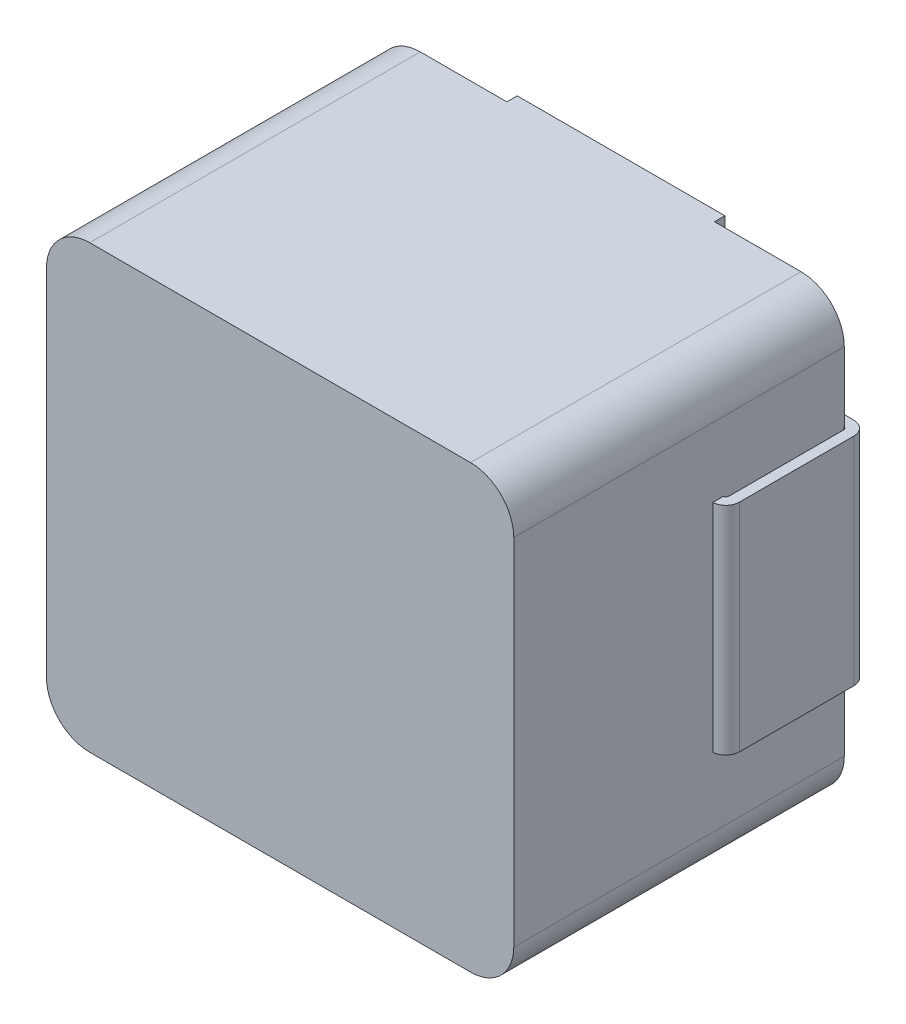
ISO-10303-21;
HEADER;
FILE_DESCRIPTION(('STEP AP214'),'2;1');
FILE_NAME('part.step','',(''),(''),'','','');
FILE_SCHEMA(('AUTOMOTIVE_DESIGN { 1 0 10303 214 1 1 1 1 }'));
ENDSEC;
DATA;
#1=APPLICATION_CONTEXT('core data for automotive mechanical design processes');
#2=APPLICATION_PROTOCOL_DEFINITION('international standard','automotive_design',2000,#1);
#3=PRODUCT_CONTEXT('',#1,'mechanical');
#4=PRODUCT('Part','Part','',(#3));
#5=PRODUCT_RELATED_PRODUCT_CATEGORY('part','',(#4));
#6=PRODUCT_DEFINITION_FORMATION('','',#4);
#7=PRODUCT_DEFINITION_CONTEXT('part definition',#1,'design');
#8=PRODUCT_DEFINITION('design','',#6,#7);
#9=PRODUCT_DEFINITION_SHAPE('','',#8);
#10=(LENGTH_UNIT() NAMED_UNIT(*) SI_UNIT(.MILLI.,.METRE.));
#11=(NAMED_UNIT(*) PLANE_ANGLE_UNIT() SI_UNIT($,.RADIAN.));
#12=(NAMED_UNIT(*) SI_UNIT($,.STERADIAN.) SOLID_ANGLE_UNIT());
#13=UNCERTAINTY_MEASURE_WITH_UNIT(LENGTH_MEASURE(1.E-05),#10,'distance_accuracy_value','');
#14=(GEOMETRIC_REPRESENTATION_CONTEXT(3) GLOBAL_UNCERTAINTY_ASSIGNED_CONTEXT((#13)) GLOBAL_UNIT_ASSIGNED_CONTEXT((#10,
#11,#12)) REPRESENTATION_CONTEXT('',''));
#15=CARTESIAN_POINT('',(0.,0.,0.));
#16=DIRECTION('',(0.,0.,1.));
#17=DIRECTION('',(1.,0.,0.));
#18=AXIS2_PLACEMENT_3D('',#15,#16,#17);
#19=CARTESIAN_POINT('',(3.4671,-1.5875,0.2794));
#20=DIRECTION('',(-1.,0.,0.));
#21=DIRECTION('',(0.,0.,1.));
#22=AXIS2_PLACEMENT_3D('',#19,#20,#21);
#23=PLANE('',#22);
#24=DIRECTION('',(0.,1.,0.));
#25=VECTOR('',#24,1.);
#26=CARTESIAN_POINT('',(3.4671,-1.5875,0.2794));
#27=LINE('',#26,#25);
#28=CARTESIAN_POINT('',(3.4671,1.5875,0.2794));
#29=VERTEX_POINT('',#28);
#30=CARTESIAN_POINT('',(3.4671,-1.5875,0.2794));
#31=VERTEX_POINT('',#30);
#32=EDGE_CURVE('E205',#29,#31,#27,.F.);
#33=ORIENTED_EDGE('',*,*,#32,.T.);
#34=DIRECTION('',(0.,0.,1.));
#35=VECTOR('',#34,1.);
#36=CARTESIAN_POINT('',(3.4671,-1.5875,0.0762));
#37=LINE('',#36,#35);
#38=CARTESIAN_POINT('',(3.4671,-1.5875,1.9558));
#39=VERTEX_POINT('',#38);
#40=EDGE_CURVE('E364',#31,#39,#37,.T.);
#41=ORIENTED_EDGE('',*,*,#40,.T.);
#42=DIRECTION('',(0.,1.,0.));
#43=VECTOR('',#42,1.);
#44=CARTESIAN_POINT('',(3.4671,-1.5875,1.9558));
#45=LINE('',#44,#43);
#46=CARTESIAN_POINT('',(3.4671,1.5875,1.9558));
#47=VERTEX_POINT('',#46);
#48=EDGE_CURVE('E400',#39,#47,#45,.T.);
#49=ORIENTED_EDGE('',*,*,#48,.T.);
#50=DIRECTION('',(0.,0.,1.));
#51=VECTOR('',#50,1.);
#52=CARTESIAN_POINT('',(3.4671,1.5875,0.0762));
#53=LINE('',#52,#51);
#54=EDGE_CURVE('E209',#29,#47,#53,.T.);
#55=ORIENTED_EDGE('',*,*,#54,.F.);
#56=EDGE_LOOP('',(#33,#41,#49,#55));
#57=FACE_BOUND('',#56,.T.);
#58=ADVANCED_FACE('F17',(#57),#23,.T.);
#59=CARTESIAN_POINT('',(3.4163,-1.5875,0.2794));
#60=DIRECTION('',(0.,1.,0.));
#61=DIRECTION('',(0.,0.,1.));
#62=AXIS2_PLACEMENT_3D('',#59,#60,#61);
#63=CYLINDRICAL_SURFACE('',#62,0.2032);
#64=DIRECTION('',(0.,1.,0.));
#65=VECTOR('',#64,1.);
#66=CARTESIAN_POINT('',(3.6195,-1.5875,0.2794));
#67=LINE('',#66,#65);
#68=CARTESIAN_POINT('',(3.6195,-1.5875,0.2794));
#69=VERTEX_POINT('',#68);
#70=CARTESIAN_POINT('',(3.6195,1.5875,0.2794));
#71=VERTEX_POINT('',#70);
#72=EDGE_CURVE('E446',#69,#71,#67,.T.);
#73=ORIENTED_EDGE('',*,*,#72,.F.);
#74=CARTESIAN_POINT('',(3.4163,-1.5875,0.2794));
#75=DIRECTION('',(0.,1.,0.));
#76=DIRECTION('',(0.,0.,1.));
#77=AXIS2_PLACEMENT_3D('',#74,#75,#76);
#78=CIRCLE('',#77,0.2032);
#79=CARTESIAN_POINT('',(3.4163,-1.5875,0.0762));
#80=VERTEX_POINT('',#79);
#81=EDGE_CURVE('E357',#69,#80,#78,.T.);
#82=ORIENTED_EDGE('',*,*,#81,.T.);
#83=DIRECTION('',(0.,1.,0.));
#84=VECTOR('',#83,1.);
#85=CARTESIAN_POINT('',(3.4163,-1.5875,0.0762));
#86=LINE('',#85,#84);
#87=CARTESIAN_POINT('',(3.4163,1.5875,0.0762));
#88=VERTEX_POINT('',#87);
#89=EDGE_CURVE('E454',#88,#80,#86,.F.);
#90=ORIENTED_EDGE('',*,*,#89,.F.);
#91=CARTESIAN_POINT('',(3.4163,1.5875,0.2794));
#92=DIRECTION('',(0.,1.,0.));
#93=DIRECTION('',(0.,0.,1.));
#94=AXIS2_PLACEMENT_3D('',#91,#92,#93);
#95=CIRCLE('',#94,0.2032);
#96=EDGE_CURVE('E384',#71,#88,#95,.T.);
#97=ORIENTED_EDGE('',*,*,#96,.F.);
#98=EDGE_LOOP('',(#73,#82,#90,#97));
#99=FACE_BOUND('',#98,.T.);
#100=ADVANCED_FACE('F515',(#99),#63,.T.);
#101=CARTESIAN_POINT('',(3.4163,-1.5875,0.0762));
#102=DIRECTION('',(0.,0.,-1.));
#103=DIRECTION('',(-1.,0.,0.));
#104=AXIS2_PLACEMENT_3D('',#101,#102,#103);
#105=PLANE('',#104);
#106=ORIENTED_EDGE('',*,*,#89,.T.);
#107=DIRECTION('',(1.,0.,0.));
#108=VECTOR('',#107,1.);
#109=CARTESIAN_POINT('',(0.,-1.5875,0.0762));
#110=LINE('',#109,#108);
#111=CARTESIAN_POINT('',(2.0447,-1.5875,0.0762));
#112=VERTEX_POINT('',#111);
#113=EDGE_CURVE('E353',#80,#112,#110,.F.);
#114=ORIENTED_EDGE('',*,*,#113,.T.);
#115=DIRECTION('',(0.,1.,0.));
#116=VECTOR('',#115,1.);
#117=CARTESIAN_POINT('',(2.0447,-1.5875,0.0762));
#118=LINE('',#117,#116);
#119=CARTESIAN_POINT('',(2.0447,1.5875,0.0762));
#120=VERTEX_POINT('',#119);
#121=EDGE_CURVE('E433',#120,#112,#118,.F.);
#122=ORIENTED_EDGE('',*,*,#121,.F.);
#123=DIRECTION('',(1.,0.,0.));
#124=VECTOR('',#123,1.);
#125=CARTESIAN_POINT('',(0.,1.5875,0.0762));
#126=LINE('',#125,#124);
#127=EDGE_CURVE('E380',#88,#120,#126,.F.);
#128=ORIENTED_EDGE('',*,*,#127,.F.);
#129=EDGE_LOOP('',(#106,#114,#122,#128));
#130=FACE_BOUND('',#129,.T.);
#131=ADVANCED_FACE('F520',(#130),#105,.T.);
#132=CARTESIAN_POINT('',(3.6195,-1.5875,1.9558));
#133=DIRECTION('',(1.,0.,0.));
#134=DIRECTION('',(0.,0.,-1.));
#135=AXIS2_PLACEMENT_3D('',#132,#133,#134);
#136=PLANE('',#135);
#137=DIRECTION('',(0.,1.,0.));
#138=VECTOR('',#137,1.);
#139=CARTESIAN_POINT('',(3.6195,-1.5875,1.9558));
#140=LINE('',#139,#138);
#141=CARTESIAN_POINT('',(3.6195,-1.5875,1.9558));
#142=VERTEX_POINT('',#141);
#143=CARTESIAN_POINT('',(3.6195,1.5875,1.9558));
#144=VERTEX_POINT('',#143);
#145=EDGE_CURVE('E447',#142,#144,#140,.T.);
#146=ORIENTED_EDGE('',*,*,#145,.F.);
#147=DIRECTION('',(0.,0.,1.));
#148=VECTOR('',#147,1.);
#149=CARTESIAN_POINT('',(3.6195,-1.5875,0.0762));
#150=LINE('',#149,#148);
#151=EDGE_CURVE('E360',#142,#69,#150,.F.);
#152=ORIENTED_EDGE('',*,*,#151,.T.);
#153=ORIENTED_EDGE('',*,*,#72,.T.);
#154=DIRECTION('',(0.,0.,1.));
#155=VECTOR('',#154,1.);
#156=CARTESIAN_POINT('',(3.6195,1.5875,0.0762));
#157=LINE('',#156,#155);
#158=EDGE_CURVE('E387',#144,#71,#157,.F.);
#159=ORIENTED_EDGE('',*,*,#158,.F.);
#160=EDGE_LOOP('',(#146,#152,#153,#159));
#161=FACE_BOUND('',#160,.T.);
#162=ADVANCED_FACE('F926',(#161),#136,.T.);
#163=CARTESIAN_POINT('',(-2.0447,-1.5875,0.0762));
#164=DIRECTION('',(0.,0.,-1.));
#165=DIRECTION('',(-1.,0.,0.));
#166=AXIS2_PLACEMENT_3D('',#163,#164,#165);
#167=PLANE('',#166);
#168=DIRECTION('',(0.,1.,0.));
#169=VECTOR('',#168,1.);
#170=CARTESIAN_POINT('',(-2.0447,-1.5875,0.0762));
#171=LINE('',#170,#169);
#172=CARTESIAN_POINT('',(-2.0447,-1.5875,0.0762));
#173=VERTEX_POINT('',#172);
#174=CARTESIAN_POINT('',(-2.0447,1.5875,0.0762));
#175=VERTEX_POINT('',#174);
#176=EDGE_CURVE('E430',#173,#175,#171,.T.);
#177=ORIENTED_EDGE('',*,*,#176,.F.);
#178=DIRECTION('',(1.,0.,0.));
#179=VECTOR('',#178,1.);
#180=CARTESIAN_POINT('',(0.,-1.5875,0.0762));
#181=LINE('',#180,#179);
#182=CARTESIAN_POINT('',(-3.4163,-1.5875,0.0762));
#183=VERTEX_POINT('',#182);
#184=EDGE_CURVE('E311',#173,#183,#181,.F.);
#185=ORIENTED_EDGE('',*,*,#184,.T.);
#186=DIRECTION('',(0.,1.,0.));
#187=VECTOR('',#186,1.);
#188=CARTESIAN_POINT('',(-3.4163,-1.5875,0.0761999999999999));
#189=LINE('',#188,#187);
#190=CARTESIAN_POINT('',(-3.4163,1.5875,0.0762));
#191=VERTEX_POINT('',#190);
#192=EDGE_CURVE('E443',#191,#183,#189,.F.);
#193=ORIENTED_EDGE('',*,*,#192,.F.);
#194=DIRECTION('',(1.,0.,0.));
#195=VECTOR('',#194,1.);
#196=CARTESIAN_POINT('',(0.,1.5875,0.0762));
#197=LINE('',#196,#195);
#198=EDGE_CURVE('E285',#175,#191,#197,.F.);
#199=ORIENTED_EDGE('',*,*,#198,.F.);
#200=EDGE_LOOP('',(#177,#185,#193,#199));
#201=FACE_BOUND('',#200,.T.);
#202=ADVANCED_FACE('F603',(#201),#167,.T.);
#203=CARTESIAN_POINT('',(-3.4163,-1.5875,0.2794));
#204=DIRECTION('',(0.,1.,0.));
#205=DIRECTION('',(0.,0.,1.));
#206=AXIS2_PLACEMENT_3D('',#203,#204,#205);
#207=CYLINDRICAL_SURFACE('',#206,0.2032);
#208=ORIENTED_EDGE('',*,*,#192,.T.);
#209=CARTESIAN_POINT('',(-3.4163,-1.5875,0.2794));
#210=DIRECTION('',(0.,1.,0.));
#211=DIRECTION('',(0.,0.,1.));
#212=AXIS2_PLACEMENT_3D('',#209,#210,#211);
#213=CIRCLE('',#212,0.2032);
#214=CARTESIAN_POINT('',(-3.6195,-1.5875,0.2794));
#215=VERTEX_POINT('',#214);
#216=EDGE_CURVE('E310',#183,#215,#213,.T.);
#217=ORIENTED_EDGE('',*,*,#216,.T.);
#218=DIRECTION('',(0.,1.,0.));
#219=VECTOR('',#218,1.);
#220=CARTESIAN_POINT('',(-3.6195,-1.5875,0.2794));
#221=LINE('',#220,#219);
#222=CARTESIAN_POINT('',(-3.6195,1.5875,0.2794));
#223=VERTEX_POINT('',#222);
#224=EDGE_CURVE('E434',#223,#215,#221,.F.);
#225=ORIENTED_EDGE('',*,*,#224,.F.);
#226=CARTESIAN_POINT('',(-3.4163,1.5875,0.2794));
#227=DIRECTION('',(0.,1.,0.));
#228=DIRECTION('',(0.,0.,1.));
#229=AXIS2_PLACEMENT_3D('',#226,#227,#228);
#230=CIRCLE('',#229,0.2032);
#231=EDGE_CURVE('E284',#191,#223,#230,.T.);
#232=ORIENTED_EDGE('',*,*,#231,.F.);
#233=EDGE_LOOP('',(#208,#217,#225,#232));
#234=FACE_BOUND('',#233,.T.);
#235=ADVANCED_FACE('F622',(#234),#207,.T.);
#236=CARTESIAN_POINT('',(-3.4671,-1.5875,1.9558));
#237=DIRECTION('',(1.,0.,0.));
#238=DIRECTION('',(0.,0.,-1.));
#239=AXIS2_PLACEMENT_3D('',#236,#237,#238);
#240=PLANE('',#239);
#241=DIRECTION('',(0.,1.,0.));
#242=VECTOR('',#241,1.);
#243=CARTESIAN_POINT('',(-3.4671,-1.5875,1.9558));
#244=LINE('',#243,#242);
#245=CARTESIAN_POINT('',(-3.4671,1.5875,1.9558));
#246=VERTEX_POINT('',#245);
#247=CARTESIAN_POINT('',(-3.4671,-1.5875,1.9558));
#248=VERTEX_POINT('',#247);
#249=EDGE_CURVE('E439',#246,#248,#244,.F.);
#250=ORIENTED_EDGE('',*,*,#249,.T.);
#251=DIRECTION('',(0.,0.,1.));
#252=VECTOR('',#251,1.);
#253=CARTESIAN_POINT('',(-3.4671,-1.5875,0.0762));
#254=LINE('',#253,#252);
#255=CARTESIAN_POINT('',(-3.4671,-1.5875,0.2794));
#256=VERTEX_POINT('',#255);
#257=EDGE_CURVE('E305',#248,#256,#254,.F.);
#258=ORIENTED_EDGE('',*,*,#257,.T.);
#259=DIRECTION('',(0.,1.,0.));
#260=VECTOR('',#259,1.);
#261=CARTESIAN_POINT('',(-3.4671,-1.5875,0.2794));
#262=LINE('',#261,#260);
#263=CARTESIAN_POINT('',(-3.4671,1.5875,0.2794));
#264=VERTEX_POINT('',#263);
#265=EDGE_CURVE('E414',#256,#264,#262,.T.);
#266=ORIENTED_EDGE('',*,*,#265,.T.);
#267=DIRECTION('',(0.,0.,1.));
#268=VECTOR('',#267,1.);
#269=CARTESIAN_POINT('',(-3.4671,1.5875,0.0762));
#270=LINE('',#269,#268);
#271=EDGE_CURVE('E277',#246,#264,#270,.F.);
#272=ORIENTED_EDGE('',*,*,#271,.F.);
#273=EDGE_LOOP('',(#250,#258,#266,#272));
#274=FACE_BOUND('',#273,.T.);
#275=ADVANCED_FACE('F641',(#274),#240,.T.);
#276=CARTESIAN_POINT('',(-3.6195,-1.5875,0.2794));
#277=DIRECTION('',(-1.,0.,0.));
#278=DIRECTION('',(0.,0.,1.));
#279=AXIS2_PLACEMENT_3D('',#276,#277,#278);
#280=PLANE('',#279);
#281=ORIENTED_EDGE('',*,*,#224,.T.);
#282=DIRECTION('',(0.,0.,1.));
#283=VECTOR('',#282,1.);
#284=CARTESIAN_POINT('',(-3.6195,-1.5875,0.0762));
#285=LINE('',#284,#283);
#286=CARTESIAN_POINT('',(-3.6195,-1.5875,1.9558));
#287=VERTEX_POINT('',#286);
#288=EDGE_CURVE('E308',#215,#287,#285,.T.);
#289=ORIENTED_EDGE('',*,*,#288,.T.);
#290=DIRECTION('',(0.,1.,0.));
#291=VECTOR('',#290,1.);
#292=CARTESIAN_POINT('',(-3.6195,-1.5875,1.9558));
#293=LINE('',#292,#291);
#294=CARTESIAN_POINT('',(-3.6195,1.5875,1.9558));
#295=VERTEX_POINT('',#294);
#296=EDGE_CURVE('E427',#295,#287,#293,.F.);
#297=ORIENTED_EDGE('',*,*,#296,.F.);
#298=DIRECTION('',(0.,0.,1.));
#299=VECTOR('',#298,1.);
#300=CARTESIAN_POINT('',(-3.6195,1.5875,0.0762));
#301=LINE('',#300,#299);
#302=EDGE_CURVE('E282',#223,#295,#301,.T.);
#303=ORIENTED_EDGE('',*,*,#302,.F.);
#304=EDGE_LOOP('',(#281,#289,#297,#303));
#305=FACE_BOUND('',#304,.T.);
#306=ADVANCED_FACE('F628',(#305),#280,.T.);
#307=CARTESIAN_POINT('',(-2.0447,-1.5875,0.2286));
#308=DIRECTION('',(1.,0.,0.));
#309=DIRECTION('',(0.,0.,-1.));
#310=AXIS2_PLACEMENT_3D('',#307,#308,#309);
#311=PLANE('',#310);
#312=DIRECTION('',(0.,1.,0.));
#313=VECTOR('',#312,1.);
#314=CARTESIAN_POINT('',(-2.0447,-3.2385,0.2286));
#315=LINE('',#314,#313);
#316=CARTESIAN_POINT('',(-2.0447,1.5875,0.2286));
#317=VERTEX_POINT('',#316);
#318=CARTESIAN_POINT('',(-2.0447,-1.5875,0.2286));
#319=VERTEX_POINT('',#318);
#320=EDGE_CURVE('E319',#317,#319,#315,.F.);
#321=ORIENTED_EDGE('',*,*,#320,.T.);
#322=DIRECTION('',(0.,0.,1.));
#323=VECTOR('',#322,1.);
#324=CARTESIAN_POINT('',(-2.0447,-1.5875,0.0762));
#325=LINE('',#324,#323);
#326=EDGE_CURVE('E313',#319,#173,#325,.F.);
#327=ORIENTED_EDGE('',*,*,#326,.T.);
#328=ORIENTED_EDGE('',*,*,#176,.T.);
#329=DIRECTION('',(0.,0.,1.));
#330=VECTOR('',#329,1.);
#331=CARTESIAN_POINT('',(-2.0447,1.5875,0.0762));
#332=LINE('',#331,#330);
#333=EDGE_CURVE('E421',#317,#175,#332,.F.);
#334=ORIENTED_EDGE('',*,*,#333,.F.);
#335=EDGE_LOOP('',(#321,#327,#328,#334));
#336=FACE_BOUND('',#335,.T.);
#337=ADVANCED_FACE('F607',(#336),#311,.T.);
#338=CARTESIAN_POINT('',(2.0447,-1.5875,0.0762));
#339=DIRECTION('',(-1.,0.,0.));
#340=DIRECTION('',(0.,0.,1.));
#341=AXIS2_PLACEMENT_3D('',#338,#339,#340);
#342=PLANE('',#341);
#343=DIRECTION('',(0.,0.,1.));
#344=VECTOR('',#343,1.);
#345=CARTESIAN_POINT('',(2.0447,-1.5875,0.0762));
#346=LINE('',#345,#344);
#347=CARTESIAN_POINT('',(2.0447,-1.5875,0.2286));
#348=VERTEX_POINT('',#347);
#349=EDGE_CURVE('E356',#112,#348,#346,.T.);
#350=ORIENTED_EDGE('',*,*,#349,.T.);
#351=DIRECTION('',(0.,1.,0.));
#352=VECTOR('',#351,1.);
#353=CARTESIAN_POINT('',(2.0447,-3.2385,0.2286));
#354=LINE('',#353,#352);
#355=CARTESIAN_POINT('',(2.0447,1.5875,0.2286));
#356=VERTEX_POINT('',#355);
#357=EDGE_CURVE('E393',#348,#356,#354,.T.);
#358=ORIENTED_EDGE('',*,*,#357,.T.);
#359=DIRECTION('',(0.,0.,1.));
#360=VECTOR('',#359,1.);
#361=CARTESIAN_POINT('',(2.0447,1.5875,0.0762));
#362=LINE('',#361,#360);
#363=EDGE_CURVE('E383',#120,#356,#362,.T.);
#364=ORIENTED_EDGE('',*,*,#363,.F.);
#365=ORIENTED_EDGE('',*,*,#121,.T.);
#366=EDGE_LOOP('',(#350,#358,#364,#365));
#367=FACE_BOUND('',#366,.T.);
#368=ADVANCED_FACE('F525',(#367),#342,.T.);
#369=CARTESIAN_POINT('',(3.4163,-1.5875,0.2794));
#370=DIRECTION('',(0.,1.,0.));
#371=DIRECTION('',(0.,0.,1.));
#372=AXIS2_PLACEMENT_3D('',#369,#370,#371);
#373=CYLINDRICAL_SURFACE('',#372,0.0508);
#374=ORIENTED_EDGE('',*,*,#32,.F.);
#375=CARTESIAN_POINT('',(3.4163,1.5875,0.2794));
#376=DIRECTION('',(0.,1.,0.));
#377=DIRECTION('',(0.,0.,1.));
#378=AXIS2_PLACEMENT_3D('',#375,#376,#377);
#379=CIRCLE('',#378,0.0508);
#380=CARTESIAN_POINT('',(3.429,1.5875,0.230213111503162));
#381=VERTEX_POINT('',#380);
#382=EDGE_CURVE('E20',#381,#29,#379,.F.);
#383=ORIENTED_EDGE('',*,*,#382,.F.);
#384=DIRECTION('',(0.,1.,0.));
#385=VECTOR('',#384,1.);
#386=CARTESIAN_POINT('',(3.429,-3.2385,0.230213111503158));
#387=LINE('',#386,#385);
#388=CARTESIAN_POINT('',(3.429,-1.5875,0.230213111503162));
#389=VERTEX_POINT('',#388);
#390=EDGE_CURVE('E203',#389,#381,#387,.T.);
#391=ORIENTED_EDGE('',*,*,#390,.F.);
#392=CARTESIAN_POINT('',(3.4163,-1.5875,0.2794));
#393=DIRECTION('',(0.,1.,0.));
#394=DIRECTION('',(0.,0.,1.));
#395=AXIS2_PLACEMENT_3D('',#392,#393,#394);
#396=CIRCLE('',#395,0.0508);
#397=EDGE_CURVE('E366',#389,#31,#396,.F.);
#398=ORIENTED_EDGE('',*,*,#397,.T.);
#399=EDGE_LOOP('',(#374,#383,#391,#398));
#400=FACE_BOUND('',#399,.T.);
#401=ADVANCED_FACE('F200',(#400),#373,.F.);
#402=CARTESIAN_POINT('',(0.,1.5875,0.0762));
#403=DIRECTION('',(0.,1.,0.));
#404=DIRECTION('',(0.,0.,1.));
#405=AXIS2_PLACEMENT_3D('',#402,#403,#404);
#406=PLANE('',#405);
#407=DIRECTION('',(1.,0.,0.));
#408=VECTOR('',#407,1.);
#409=CARTESIAN_POINT('',(3.429,1.5875,0.2286));
#410=LINE('',#409,#408);
#411=CARTESIAN_POINT('',(3.429,1.5875,0.2286));
#412=VERTEX_POINT('',#411);
#413=EDGE_CURVE('E215',#356,#412,#410,.T.);
#414=ORIENTED_EDGE('',*,*,#413,.T.);
#415=DIRECTION('',(0.,0.,-1.));
#416=VECTOR('',#415,1.);
#417=CARTESIAN_POINT('',(3.429,1.5875,0.0762));
#418=LINE('',#417,#416);
#419=EDGE_CURVE('E211',#381,#412,#418,.T.);
#420=ORIENTED_EDGE('',*,*,#419,.F.);
#421=ORIENTED_EDGE('',*,*,#382,.T.);
#422=ORIENTED_EDGE('',*,*,#54,.T.);
#423=CARTESIAN_POINT('',(3.4163,1.5875,1.9558));
#424=DIRECTION('',(0.,1.,0.));
#425=DIRECTION('',(0.,0.,1.));
#426=AXIS2_PLACEMENT_3D('',#423,#424,#425);
#427=CIRCLE('',#426,0.0508);
#428=CARTESIAN_POINT('',(3.429,1.5875,2.00498688849679));
#429=VERTEX_POINT('',#428);
#430=EDGE_CURVE('E459',#47,#429,#427,.F.);
#431=ORIENTED_EDGE('',*,*,#430,.T.);
#432=DIRECTION('',(0.,0.,-1.));
#433=VECTOR('',#432,1.);
#434=CARTESIAN_POINT('',(3.429,1.5875,0.0762));
#435=LINE('',#434,#433);
#436=CARTESIAN_POINT('',(3.429,1.5875,2.15860273666798));
#437=VERTEX_POINT('',#436);
#438=EDGE_CURVE('E371',#437,#429,#435,.T.);
#439=ORIENTED_EDGE('',*,*,#438,.F.);
#440=CARTESIAN_POINT('',(3.4163,1.5875,1.9558));
#441=DIRECTION('',(0.,1.,0.));
#442=DIRECTION('',(0.,0.,1.));
#443=AXIS2_PLACEMENT_3D('',#440,#441,#442);
#444=CIRCLE('',#443,0.2032);
#445=EDGE_CURVE('E438',#144,#437,#444,.F.);
#446=ORIENTED_EDGE('',*,*,#445,.F.);
#447=ORIENTED_EDGE('',*,*,#158,.T.);
#448=ORIENTED_EDGE('',*,*,#96,.T.);
#449=ORIENTED_EDGE('',*,*,#127,.T.);
#450=ORIENTED_EDGE('',*,*,#363,.T.);
#451=EDGE_LOOP('',(#414,#420,#421,#422,#431,#439,#446,#447,#448,#449,#450));
#452=FACE_BOUND('',#451,.T.);
#453=ADVANCED_FACE('F212',(#452),#406,.T.);
#454=CARTESIAN_POINT('',(3.4163,-1.5875,1.9558));
#455=DIRECTION('',(0.,1.,0.));
#456=DIRECTION('',(0.,0.,1.));
#457=AXIS2_PLACEMENT_3D('',#454,#455,#456);
#458=CYLINDRICAL_SURFACE('',#457,0.0508);
#459=ORIENTED_EDGE('',*,*,#48,.F.);
#460=CARTESIAN_POINT('',(3.4163,-1.5875,1.9558));
#461=DIRECTION('',(0.,1.,0.));
#462=DIRECTION('',(0.,0.,1.));
#463=AXIS2_PLACEMENT_3D('',#460,#461,#462);
#464=CIRCLE('',#463,0.0508);
#465=CARTESIAN_POINT('',(3.429,-1.5875,2.00498688849679));
#466=VERTEX_POINT('',#465);
#467=EDGE_CURVE('E363',#39,#466,#464,.F.);
#468=ORIENTED_EDGE('',*,*,#467,.T.);
#469=DIRECTION('',(0.,1.,0.));
#470=VECTOR('',#469,1.);
#471=CARTESIAN_POINT('',(3.429,-3.2385,2.00498688849674));
#472=LINE('',#471,#470);
#473=EDGE_CURVE('E367',#429,#466,#472,.F.);
#474=ORIENTED_EDGE('',*,*,#473,.F.);
#475=ORIENTED_EDGE('',*,*,#430,.F.);
#476=EDGE_LOOP('',(#459,#468,#474,#475));
#477=FACE_BOUND('',#476,.T.);
#478=ADVANCED_FACE('F860',(#477),#458,.F.);
#479=CARTESIAN_POINT('',(0.,-1.5875,0.0762));
#480=DIRECTION('',(0.,1.,0.));
#481=DIRECTION('',(0.,0.,1.));
#482=AXIS2_PLACEMENT_3D('',#479,#480,#481);
#483=PLANE('',#482);
#484=ORIENTED_EDGE('',*,*,#349,.F.);
#485=ORIENTED_EDGE('',*,*,#113,.F.);
#486=ORIENTED_EDGE('',*,*,#81,.F.);
#487=ORIENTED_EDGE('',*,*,#151,.F.);
#488=CARTESIAN_POINT('',(3.4163,-1.5875,1.9558));
#489=DIRECTION('',(0.,1.,0.));
#490=DIRECTION('',(0.,0.,1.));
#491=AXIS2_PLACEMENT_3D('',#488,#489,#490);
#492=CIRCLE('',#491,0.2032);
#493=CARTESIAN_POINT('',(3.429,-1.5875,2.15860273666798));
#494=VERTEX_POINT('',#493);
#495=EDGE_CURVE('E409',#494,#142,#492,.T.);
#496=ORIENTED_EDGE('',*,*,#495,.F.);
#497=DIRECTION('',(0.,0.,-1.));
#498=VECTOR('',#497,1.);
#499=CARTESIAN_POINT('',(3.429,-1.5875,0.0762));
#500=LINE('',#499,#498);
#501=EDGE_CURVE('E370',#466,#494,#500,.F.);
#502=ORIENTED_EDGE('',*,*,#501,.F.);
#503=ORIENTED_EDGE('',*,*,#467,.F.);
#504=ORIENTED_EDGE('',*,*,#40,.F.);
#505=ORIENTED_EDGE('',*,*,#397,.F.);
#506=DIRECTION('',(0.,0.,-1.));
#507=VECTOR('',#506,1.);
#508=CARTESIAN_POINT('',(3.429,-1.5875,0.0762));
#509=LINE('',#508,#507);
#510=CARTESIAN_POINT('',(3.429,-1.5875,0.2286));
#511=VERTEX_POINT('',#510);
#512=EDGE_CURVE('E224',#511,#389,#509,.F.);
#513=ORIENTED_EDGE('',*,*,#512,.F.);
#514=DIRECTION('',(1.,0.,0.));
#515=VECTOR('',#514,1.);
#516=CARTESIAN_POINT('',(3.429,-1.5875,0.2286));
#517=LINE('',#516,#515);
#518=EDGE_CURVE('E248',#511,#348,#517,.F.);
#519=ORIENTED_EDGE('',*,*,#518,.T.);
#520=EDGE_LOOP('',(#484,#485,#486,#487,#496,#502,#503,#504,#505,#513,#519));
#521=FACE_BOUND('',#520,.T.);
#522=ADVANCED_FACE('F851',(#521),#483,.F.);
#523=CARTESIAN_POINT('',(3.4163,-1.5875,1.9558));
#524=DIRECTION('',(0.,1.,0.));
#525=DIRECTION('',(0.,0.,1.));
#526=AXIS2_PLACEMENT_3D('',#523,#524,#525);
#527=CYLINDRICAL_SURFACE('',#526,0.2032);
#528=ORIENTED_EDGE('',*,*,#445,.T.);
#529=DIRECTION('',(0.,1.,0.));
#530=VECTOR('',#529,1.);
#531=CARTESIAN_POINT('',(3.429,-3.2385,2.15860273666804));
#532=LINE('',#531,#530);
#533=EDGE_CURVE('E374',#494,#437,#532,.T.);
#534=ORIENTED_EDGE('',*,*,#533,.F.);
#535=ORIENTED_EDGE('',*,*,#495,.T.);
#536=ORIENTED_EDGE('',*,*,#145,.T.);
#537=EDGE_LOOP('',(#528,#534,#535,#536));
#538=FACE_BOUND('',#537,.T.);
#539=ADVANCED_FACE('F843',(#538),#527,.T.);
#540=CARTESIAN_POINT('',(-3.4163,-1.5875,0.2794));
#541=DIRECTION('',(0.,1.,0.));
#542=DIRECTION('',(0.,0.,1.));
#543=AXIS2_PLACEMENT_3D('',#540,#541,#542);
#544=CYLINDRICAL_SURFACE('',#543,0.0508);
#545=ORIENTED_EDGE('',*,*,#265,.F.);
#546=CARTESIAN_POINT('',(-3.4163,-1.5875,0.2794));
#547=DIRECTION('',(0.,1.,0.));
#548=DIRECTION('',(0.,0.,1.));
#549=AXIS2_PLACEMENT_3D('',#546,#547,#548);
#550=CIRCLE('',#549,0.0508);
#551=CARTESIAN_POINT('',(-3.429,-1.5875,0.230213111503162));
#552=VERTEX_POINT('',#551);
#553=EDGE_CURVE('E307',#256,#552,#550,.F.);
#554=ORIENTED_EDGE('',*,*,#553,.T.);
#555=DIRECTION('',(0.,1.,0.));
#556=VECTOR('',#555,1.);
#557=CARTESIAN_POINT('',(-3.429,3.2385,0.230213111503158));
#558=LINE('',#557,#556);
#559=CARTESIAN_POINT('',(-3.429,1.5875,0.230213111503162));
#560=VERTEX_POINT('',#559);
#561=EDGE_CURVE('E480',#560,#552,#558,.F.);
#562=ORIENTED_EDGE('',*,*,#561,.F.);
#563=CARTESIAN_POINT('',(-3.4163,1.5875,0.2794));
#564=DIRECTION('',(0.,1.,0.));
#565=DIRECTION('',(0.,0.,1.));
#566=AXIS2_PLACEMENT_3D('',#563,#564,#565);
#567=CIRCLE('',#566,0.0508);
#568=EDGE_CURVE('E280',#264,#560,#567,.F.);
#569=ORIENTED_EDGE('',*,*,#568,.F.);
#570=EDGE_LOOP('',(#545,#554,#562,#569));
#571=FACE_BOUND('',#570,.T.);
#572=ADVANCED_FACE('F647',(#571),#544,.F.);
#573=CARTESIAN_POINT('',(0.,-1.5875,0.0762));
#574=DIRECTION('',(0.,1.,0.));
#575=DIRECTION('',(0.,0.,1.));
#576=AXIS2_PLACEMENT_3D('',#573,#574,#575);
#577=PLANE('',#576);
#578=ORIENTED_EDGE('',*,*,#257,.F.);
#579=CARTESIAN_POINT('',(-3.4163,-1.5875,1.9558));
#580=DIRECTION('',(0.,1.,0.));
#581=DIRECTION('',(0.,0.,1.));
#582=AXIS2_PLACEMENT_3D('',#579,#580,#581);
#583=CIRCLE('',#582,0.0508);
#584=CARTESIAN_POINT('',(-3.429,-1.5875,2.00498688849679));
#585=VERTEX_POINT('',#584);
#586=EDGE_CURVE('E288',#248,#585,#583,.T.);
#587=ORIENTED_EDGE('',*,*,#586,.T.);
#588=DIRECTION('',(0.,0.,1.));
#589=VECTOR('',#588,1.);
#590=CARTESIAN_POINT('',(-3.429,-1.5875,0.0762));
#591=LINE('',#590,#589);
#592=CARTESIAN_POINT('',(-3.429,-1.5875,2.15860273666798));
#593=VERTEX_POINT('',#592);
#594=EDGE_CURVE('E295',#593,#585,#591,.F.);
#595=ORIENTED_EDGE('',*,*,#594,.F.);
#596=CARTESIAN_POINT('',(-3.4163,-1.5875,1.9558));
#597=DIRECTION('',(0.,1.,0.));
#598=DIRECTION('',(0.,0.,1.));
#599=AXIS2_PLACEMENT_3D('',#596,#597,#598);
#600=CIRCLE('',#599,0.2032);
#601=EDGE_CURVE('E320',#287,#593,#600,.T.);
#602=ORIENTED_EDGE('',*,*,#601,.F.);
#603=ORIENTED_EDGE('',*,*,#288,.F.);
#604=ORIENTED_EDGE('',*,*,#216,.F.);
#605=ORIENTED_EDGE('',*,*,#184,.F.);
#606=ORIENTED_EDGE('',*,*,#326,.F.);
#607=DIRECTION('',(1.,0.,0.));
#608=VECTOR('',#607,1.);
#609=CARTESIAN_POINT('',(-1.524,-1.5875,0.2286));
#610=LINE('',#609,#608);
#611=CARTESIAN_POINT('',(-3.429,-1.5875,0.2286));
#612=VERTEX_POINT('',#611);
#613=EDGE_CURVE('E269',#319,#612,#610,.F.);
#614=ORIENTED_EDGE('',*,*,#613,.T.);
#615=DIRECTION('',(0.,0.,1.));
#616=VECTOR('',#615,1.);
#617=CARTESIAN_POINT('',(-3.429,-1.5875,0.0762));
#618=LINE('',#617,#616);
#619=EDGE_CURVE('E304',#552,#612,#618,.F.);
#620=ORIENTED_EDGE('',*,*,#619,.F.);
#621=ORIENTED_EDGE('',*,*,#553,.F.);
#622=EDGE_LOOP('',(#578,#587,#595,#602,#603,#604,#605,#606,#614,#620,#621));
#623=FACE_BOUND('',#622,.T.);
#624=ADVANCED_FACE('F617',(#623),#577,.F.);
#625=CARTESIAN_POINT('',(-3.4163,-1.5875,1.9558));
#626=DIRECTION('',(0.,1.,0.));
#627=DIRECTION('',(0.,0.,1.));
#628=AXIS2_PLACEMENT_3D('',#625,#626,#627);
#629=CYLINDRICAL_SURFACE('',#628,0.0508);
#630=ORIENTED_EDGE('',*,*,#249,.F.);
#631=CARTESIAN_POINT('',(-3.4163,1.5875,1.9558));
#632=DIRECTION('',(0.,1.,0.));
#633=DIRECTION('',(0.,0.,1.));
#634=AXIS2_PLACEMENT_3D('',#631,#632,#633);
#635=CIRCLE('',#634,0.0508);
#636=CARTESIAN_POINT('',(-3.429,1.5875,2.00498688849679));
#637=VERTEX_POINT('',#636);
#638=EDGE_CURVE('E281',#637,#246,#635,.F.);
#639=ORIENTED_EDGE('',*,*,#638,.F.);
#640=DIRECTION('',(0.,1.,0.));
#641=VECTOR('',#640,1.);
#642=CARTESIAN_POINT('',(-3.429,3.2385,2.00498688849674));
#643=LINE('',#642,#641);
#644=EDGE_CURVE('E291',#585,#637,#643,.T.);
#645=ORIENTED_EDGE('',*,*,#644,.F.);
#646=ORIENTED_EDGE('',*,*,#586,.F.);
#647=EDGE_LOOP('',(#630,#639,#645,#646));
#648=FACE_BOUND('',#647,.T.);
#649=ADVANCED_FACE('F638',(#648),#629,.F.);
#650=CARTESIAN_POINT('',(0.,1.5875,0.0762));
#651=DIRECTION('',(0.,1.,0.));
#652=DIRECTION('',(0.,0.,1.));
#653=AXIS2_PLACEMENT_3D('',#650,#651,#652);
#654=PLANE('',#653);
#655=DIRECTION('',(1.,0.,0.));
#656=VECTOR('',#655,1.);
#657=CARTESIAN_POINT('',(-1.524,1.5875,0.2286));
#658=LINE('',#657,#656);
#659=CARTESIAN_POINT('',(-3.429,1.5875,0.2286));
#660=VERTEX_POINT('',#659);
#661=EDGE_CURVE('E316',#660,#317,#658,.T.);
#662=ORIENTED_EDGE('',*,*,#661,.T.);
#663=ORIENTED_EDGE('',*,*,#333,.T.);
#664=ORIENTED_EDGE('',*,*,#198,.T.);
#665=ORIENTED_EDGE('',*,*,#231,.T.);
#666=ORIENTED_EDGE('',*,*,#302,.T.);
#667=CARTESIAN_POINT('',(-3.4163,1.5875,1.9558));
#668=DIRECTION('',(0.,1.,0.));
#669=DIRECTION('',(0.,0.,1.));
#670=AXIS2_PLACEMENT_3D('',#667,#668,#669);
#671=CIRCLE('',#670,0.2032);
#672=CARTESIAN_POINT('',(-3.429,1.5875,2.15860273666798));
#673=VERTEX_POINT('',#672);
#674=EDGE_CURVE('E424',#673,#295,#671,.F.);
#675=ORIENTED_EDGE('',*,*,#674,.F.);
#676=DIRECTION('',(0.,0.,1.));
#677=VECTOR('',#676,1.);
#678=CARTESIAN_POINT('',(-3.429,1.5875,0.0762));
#679=LINE('',#678,#677);
#680=EDGE_CURVE('E294',#637,#673,#679,.T.);
#681=ORIENTED_EDGE('',*,*,#680,.F.);
#682=ORIENTED_EDGE('',*,*,#638,.T.);
#683=ORIENTED_EDGE('',*,*,#271,.T.);
#684=ORIENTED_EDGE('',*,*,#568,.T.);
#685=DIRECTION('',(0.,0.,1.));
#686=VECTOR('',#685,1.);
#687=CARTESIAN_POINT('',(-3.429,1.5875,0.0762));
#688=LINE('',#687,#686);
#689=EDGE_CURVE('E481',#660,#560,#688,.T.);
#690=ORIENTED_EDGE('',*,*,#689,.F.);
#691=EDGE_LOOP('',(#662,#663,#664,#665,#666,#675,#681,#682,#683,#684,#690));
#692=FACE_BOUND('',#691,.T.);
#693=ADVANCED_FACE('F610',(#692),#654,.T.);
#694=CARTESIAN_POINT('',(-3.4163,-1.5875,1.9558));
#695=DIRECTION('',(0.,1.,0.));
#696=DIRECTION('',(0.,0.,1.));
#697=AXIS2_PLACEMENT_3D('',#694,#695,#696);
#698=CYLINDRICAL_SURFACE('',#697,0.2032);
#699=ORIENTED_EDGE('',*,*,#601,.T.);
#700=DIRECTION('',(0.,1.,0.));
#701=VECTOR('',#700,1.);
#702=CARTESIAN_POINT('',(-3.429,3.2385,2.15860273666804));
#703=LINE('',#702,#701);
#704=EDGE_CURVE('E298',#673,#593,#703,.F.);
#705=ORIENTED_EDGE('',*,*,#704,.F.);
#706=ORIENTED_EDGE('',*,*,#674,.T.);
#707=ORIENTED_EDGE('',*,*,#296,.T.);
#708=EDGE_LOOP('',(#699,#705,#706,#707));
#709=FACE_BOUND('',#708,.T.);
#710=ADVANCED_FACE('F631',(#709),#698,.T.);
#711=CARTESIAN_POINT('',(-1.524,-3.2385,0.2286));
#712=DIRECTION('',(0.,0.,1.));
#713=DIRECTION('',(1.,0.,0.));
#714=AXIS2_PLACEMENT_3D('',#711,#712,#713);
#715=PLANE('',#714);
#716=DIRECTION('',(1.,0.,0.));
#717=VECTOR('',#716,1.);
#718=CARTESIAN_POINT('',(3.429,3.2385,0.2286));
#719=LINE('',#718,#717);
#720=CARTESIAN_POINT('',(-1.524,3.2385,0.2286));
#721=VERTEX_POINT('',#720);
#722=CARTESIAN_POINT('',(-2.794,3.2385,0.2286));
#723=VERTEX_POINT('',#722);
#724=EDGE_CURVE('E326',#721,#723,#719,.F.);
#725=ORIENTED_EDGE('',*,*,#724,.F.);
#726=DIRECTION('',(0.,1.,0.));
#727=VECTOR('',#726,1.);
#728=CARTESIAN_POINT('',(-1.524,-3.2385,0.2286));
#729=LINE('',#728,#727);
#730=CARTESIAN_POINT('',(-1.524,-3.2385,0.2286));
#731=VERTEX_POINT('',#730);
#732=EDGE_CURVE('E259',#721,#731,#729,.F.);
#733=ORIENTED_EDGE('',*,*,#732,.T.);
#734=DIRECTION('',(1.,0.,0.));
#735=VECTOR('',#734,1.);
#736=CARTESIAN_POINT('',(-3.429,-3.2385,0.2286));
#737=LINE('',#736,#735);
#738=CARTESIAN_POINT('',(-2.794,-3.2385,0.2286));
#739=VERTEX_POINT('',#738);
#740=EDGE_CURVE('E264',#739,#731,#737,.T.);
#741=ORIENTED_EDGE('',*,*,#740,.F.);
#742=CARTESIAN_POINT('',(-2.794,-2.6035,0.2286));
#743=DIRECTION('',(0.,0.,-1.));
#744=DIRECTION('',(-1.,0.,0.));
#745=AXIS2_PLACEMENT_3D('',#742,#743,#744);
#746=CIRCLE('',#745,0.635);
#747=CARTESIAN_POINT('',(-3.429,-2.6035,0.2286));
#748=VERTEX_POINT('',#747);
#749=EDGE_CURVE('E476',#748,#739,#746,.F.);
#750=ORIENTED_EDGE('',*,*,#749,.F.);
#751=DIRECTION('',(0.,1.,0.));
#752=VECTOR('',#751,1.);
#753=CARTESIAN_POINT('',(-3.429,3.2385,0.2286));
#754=LINE('',#753,#752);
#755=EDGE_CURVE('E487',#612,#748,#754,.F.);
#756=ORIENTED_EDGE('',*,*,#755,.F.);
#757=ORIENTED_EDGE('',*,*,#613,.F.);
#758=ORIENTED_EDGE('',*,*,#320,.F.);
#759=ORIENTED_EDGE('',*,*,#661,.F.);
#760=DIRECTION('',(0.,1.,0.));
#761=VECTOR('',#760,1.);
#762=CARTESIAN_POINT('',(-3.429,3.2385,0.2286));
#763=LINE('',#762,#761);
#764=CARTESIAN_POINT('',(-3.429,2.6035,0.2286));
#765=VERTEX_POINT('',#764);
#766=EDGE_CURVE('E484',#765,#660,#763,.F.);
#767=ORIENTED_EDGE('',*,*,#766,.F.);
#768=CARTESIAN_POINT('',(-2.794,2.6035,0.2286));
#769=DIRECTION('',(0.,0.,-1.));
#770=DIRECTION('',(-1.,0.,0.));
#771=AXIS2_PLACEMENT_3D('',#768,#769,#770);
#772=CIRCLE('',#771,0.635);
#773=EDGE_CURVE('E485',#723,#765,#772,.F.);
#774=ORIENTED_EDGE('',*,*,#773,.F.);
#775=EDGE_LOOP('',(#725,#733,#741,#750,#756,#757,#758,#759,#767,#774));
#776=FACE_BOUND('',#775,.T.);
#777=ADVANCED_FACE('F575',(#776),#715,.F.);
#778=CARTESIAN_POINT('',(-1.524,-3.2385,0.0762));
#779=DIRECTION('',(1.,0.,0.));
#780=DIRECTION('',(0.,0.,-1.));
#781=AXIS2_PLACEMENT_3D('',#778,#779,#780);
#782=PLANE('',#781);
#783=DIRECTION('',(0.,0.,1.));
#784=VECTOR('',#783,1.);
#785=CARTESIAN_POINT('',(-1.524,3.2385,0.0762));
#786=LINE('',#785,#784);
#787=CARTESIAN_POINT('',(-1.524,3.2385,0.0762));
#788=VERTEX_POINT('',#787);
#789=EDGE_CURVE('E329',#788,#721,#786,.T.);
#790=ORIENTED_EDGE('',*,*,#789,.F.);
#791=DIRECTION('',(0.,1.,0.));
#792=VECTOR('',#791,1.);
#793=CARTESIAN_POINT('',(-1.524,0.,0.0762));
#794=LINE('',#793,#792);
#795=CARTESIAN_POINT('',(-1.524,-3.2385,0.0762));
#796=VERTEX_POINT('',#795);
#797=EDGE_CURVE('E249',#788,#796,#794,.F.);
#798=ORIENTED_EDGE('',*,*,#797,.T.);
#799=DIRECTION('',(0.,0.,-1.));
#800=VECTOR('',#799,1.);
#801=CARTESIAN_POINT('',(-1.524,-3.2385,0.0762));
#802=LINE('',#801,#800);
#803=EDGE_CURVE('E254',#731,#796,#802,.T.);
#804=ORIENTED_EDGE('',*,*,#803,.F.);
#805=ORIENTED_EDGE('',*,*,#732,.F.);
#806=EDGE_LOOP('',(#790,#798,#804,#805));
#807=FACE_BOUND('',#806,.T.);
#808=ADVANCED_FACE('F583',(#807),#782,.F.);
#809=CARTESIAN_POINT('',(0.,0.,0.0762));
#810=DIRECTION('',(0.,0.,1.));
#811=DIRECTION('',(1.,0.,0.));
#812=AXIS2_PLACEMENT_3D('',#809,#810,#811);
#813=PLANE('',#812);
#814=ORIENTED_EDGE('',*,*,#797,.F.);
#815=DIRECTION('',(1.,0.,0.));
#816=VECTOR('',#815,1.);
#817=CARTESIAN_POINT('',(3.429,3.2385,0.0762));
#818=LINE('',#817,#816);
#819=CARTESIAN_POINT('',(1.524,3.2385,0.0762));
#820=VERTEX_POINT('',#819);
#821=EDGE_CURVE('E341',#820,#788,#818,.F.);
#822=ORIENTED_EDGE('',*,*,#821,.F.);
#823=DIRECTION('',(0.,1.,0.));
#824=VECTOR('',#823,1.);
#825=CARTESIAN_POINT('',(1.524,-3.2385,0.0762));
#826=LINE('',#825,#824);
#827=CARTESIAN_POINT('',(1.524,-3.2385,0.0762));
#828=VERTEX_POINT('',#827);
#829=EDGE_CURVE('E245',#820,#828,#826,.F.);
#830=ORIENTED_EDGE('',*,*,#829,.T.);
#831=DIRECTION('',(1.,0.,0.));
#832=VECTOR('',#831,1.);
#833=CARTESIAN_POINT('',(-3.429,-3.2385,0.0762));
#834=LINE('',#833,#832);
#835=EDGE_CURVE('E242',#796,#828,#834,.T.);
#836=ORIENTED_EDGE('',*,*,#835,.F.);
#837=EDGE_LOOP('',(#814,#822,#830,#836));
#838=FACE_BOUND('',#837,.T.);
#839=ADVANCED_FACE('F658',(#838),#813,.F.);
#840=CARTESIAN_POINT('',(1.524,-3.2385,0.2286));
#841=DIRECTION('',(-1.,0.,0.));
#842=DIRECTION('',(0.,0.,1.));
#843=AXIS2_PLACEMENT_3D('',#840,#841,#842);
#844=PLANE('',#843);
#845=DIRECTION('',(0.,0.,1.));
#846=VECTOR('',#845,1.);
#847=CARTESIAN_POINT('',(1.524,3.2385,0.0762));
#848=LINE('',#847,#846);
#849=CARTESIAN_POINT('',(1.524,3.2385,0.2286));
#850=VERTEX_POINT('',#849);
#851=EDGE_CURVE('E338',#850,#820,#848,.F.);
#852=ORIENTED_EDGE('',*,*,#851,.F.);
#853=DIRECTION('',(0.,1.,0.));
#854=VECTOR('',#853,1.);
#855=CARTESIAN_POINT('',(1.524,-3.2385,0.2286));
#856=LINE('',#855,#854);
#857=CARTESIAN_POINT('',(1.524,-3.2385,0.2286));
#858=VERTEX_POINT('',#857);
#859=EDGE_CURVE('E225',#850,#858,#856,.F.);
#860=ORIENTED_EDGE('',*,*,#859,.T.);
#861=DIRECTION('',(0.,0.,-1.));
#862=VECTOR('',#861,1.);
#863=CARTESIAN_POINT('',(1.524,-3.2385,0.0762));
#864=LINE('',#863,#862);
#865=EDGE_CURVE('E235',#828,#858,#864,.F.);
#866=ORIENTED_EDGE('',*,*,#865,.F.);
#867=ORIENTED_EDGE('',*,*,#829,.F.);
#868=EDGE_LOOP('',(#852,#860,#866,#867));
#869=FACE_BOUND('',#868,.T.);
#870=ADVANCED_FACE('F665',(#869),#844,.F.);
#871=CARTESIAN_POINT('',(3.429,-3.2385,0.2286));
#872=DIRECTION('',(0.,0.,1.));
#873=DIRECTION('',(1.,0.,0.));
#874=AXIS2_PLACEMENT_3D('',#871,#872,#873);
#875=PLANE('',#874);
#876=DIRECTION('',(1.,0.,0.));
#877=VECTOR('',#876,1.);
#878=CARTESIAN_POINT('',(-3.429,-3.2385,0.2286));
#879=LINE('',#878,#877);
#880=CARTESIAN_POINT('',(2.794,-3.2385,0.2286));
#881=VERTEX_POINT('',#880);
#882=EDGE_CURVE('E232',#858,#881,#879,.T.);
#883=ORIENTED_EDGE('',*,*,#882,.F.);
#884=ORIENTED_EDGE('',*,*,#859,.F.);
#885=DIRECTION('',(1.,0.,0.));
#886=VECTOR('',#885,1.);
#887=CARTESIAN_POINT('',(3.429,3.2385,0.2286));
#888=LINE('',#887,#886);
#889=CARTESIAN_POINT('',(2.794,3.2385,0.2286));
#890=VERTEX_POINT('',#889);
#891=EDGE_CURVE('E332',#890,#850,#888,.F.);
#892=ORIENTED_EDGE('',*,*,#891,.F.);
#893=CARTESIAN_POINT('',(2.794,2.6035,0.2286));
#894=DIRECTION('',(0.,0.,-1.));
#895=DIRECTION('',(-1.,0.,0.));
#896=AXIS2_PLACEMENT_3D('',#893,#894,#895);
#897=CIRCLE('',#896,0.635);
#898=CARTESIAN_POINT('',(3.429,2.6035,0.2286));
#899=VERTEX_POINT('',#898);
#900=EDGE_CURVE('E342',#899,#890,#897,.F.);
#901=ORIENTED_EDGE('',*,*,#900,.F.);
#902=DIRECTION('',(0.,1.,0.));
#903=VECTOR('',#902,1.);
#904=CARTESIAN_POINT('',(3.429,-3.2385,0.2286));
#905=LINE('',#904,#903);
#906=EDGE_CURVE('E218',#412,#899,#905,.T.);
#907=ORIENTED_EDGE('',*,*,#906,.F.);
#908=ORIENTED_EDGE('',*,*,#413,.F.);
#909=ORIENTED_EDGE('',*,*,#357,.F.);
#910=ORIENTED_EDGE('',*,*,#518,.F.);
#911=DIRECTION('',(0.,1.,0.));
#912=VECTOR('',#911,1.);
#913=CARTESIAN_POINT('',(3.429,-3.2385,0.2286));
#914=LINE('',#913,#912);
#915=CARTESIAN_POINT('',(3.429,-2.6035,0.2286));
#916=VERTEX_POINT('',#915);
#917=EDGE_CURVE('E489',#916,#511,#914,.T.);
#918=ORIENTED_EDGE('',*,*,#917,.F.);
#919=CARTESIAN_POINT('',(2.794,-2.6035,0.2286));
#920=DIRECTION('',(0.,0.,-1.));
#921=DIRECTION('',(-1.,0.,0.));
#922=AXIS2_PLACEMENT_3D('',#919,#920,#921);
#923=CIRCLE('',#922,0.635);
#924=EDGE_CURVE('E473',#881,#916,#923,.F.);
#925=ORIENTED_EDGE('',*,*,#924,.F.);
#926=EDGE_LOOP('',(#883,#884,#892,#901,#907,#908,#909,#910,#918,#925));
#927=FACE_BOUND('',#926,.T.);
#928=ADVANCED_FACE('F531',(#927),#875,.F.);
#929=CARTESIAN_POINT('',(3.429,-3.2385,0.0762));
#930=DIRECTION('',(1.,0.,0.));
#931=DIRECTION('',(0.,0.,-1.));
#932=AXIS2_PLACEMENT_3D('',#929,#930,#931);
#933=PLANE('',#932);
#934=ORIENTED_EDGE('',*,*,#501,.T.);
#935=ORIENTED_EDGE('',*,*,#533,.T.);
#936=ORIENTED_EDGE('',*,*,#438,.T.);
#937=ORIENTED_EDGE('',*,*,#473,.T.);
#938=EDGE_LOOP('',(#934,#935,#936,#937));
#939=FACE_BOUND('',#938,.T.);
#940=ORIENTED_EDGE('',*,*,#917,.T.);
#941=ORIENTED_EDGE('',*,*,#512,.T.);
#942=ORIENTED_EDGE('',*,*,#390,.T.);
#943=ORIENTED_EDGE('',*,*,#419,.T.);
#944=ORIENTED_EDGE('',*,*,#906,.T.);
#945=DIRECTION('',(0.,0.,-1.));
#946=VECTOR('',#945,1.);
#947=CARTESIAN_POINT('',(3.429,2.6035,5.0982772418046));
#948=LINE('',#947,#946);
#949=CARTESIAN_POINT('',(3.429,2.6035,5.08));
#950=VERTEX_POINT('',#949);
#951=EDGE_CURVE('E377',#950,#899,#948,.T.);
#952=ORIENTED_EDGE('',*,*,#951,.F.);
#953=DIRECTION('',(0.,1.,0.));
#954=VECTOR('',#953,1.);
#955=CARTESIAN_POINT('',(3.429,0.,5.08));
#956=LINE('',#955,#954);
#957=CARTESIAN_POINT('',(3.429,-2.6035,5.08));
#958=VERTEX_POINT('',#957);
#959=EDGE_CURVE('E472',#958,#950,#956,.T.);
#960=ORIENTED_EDGE('',*,*,#959,.F.);
#961=DIRECTION('',(0.,0.,-1.));
#962=VECTOR('',#961,1.);
#963=CARTESIAN_POINT('',(3.429,-2.6035,5.0982772418046));
#964=LINE('',#963,#962);
#965=EDGE_CURVE('E234',#916,#958,#964,.F.);
#966=ORIENTED_EDGE('',*,*,#965,.F.);
#967=EDGE_LOOP('',(#940,#941,#942,#943,#944,#952,#960,#966));
#968=FACE_BOUND('',#967,.T.);
#969=ADVANCED_FACE('F222',(#939,#968),#933,.T.);
#970=CARTESIAN_POINT('',(2.794,2.6035,5.0982772418046));
#971=DIRECTION('',(0.,0.,-1.));
#972=DIRECTION('',(-1.,0.,0.));
#973=AXIS2_PLACEMENT_3D('',#970,#971,#972);
#974=CYLINDRICAL_SURFACE('',#973,0.635);
#975=ORIENTED_EDGE('',*,*,#951,.T.);
#976=ORIENTED_EDGE('',*,*,#900,.T.);
#977=DIRECTION('',(0.,0.,1.));
#978=VECTOR('',#977,1.);
#979=CARTESIAN_POINT('',(2.794,3.2385,0.0762));
#980=LINE('',#979,#978);
#981=CARTESIAN_POINT('',(2.794,3.2385,5.08));
#982=VERTEX_POINT('',#981);
#983=EDGE_CURVE('E328',#982,#890,#980,.F.);
#984=ORIENTED_EDGE('',*,*,#983,.F.);
#985=CARTESIAN_POINT('',(2.794,2.6035,5.08));
#986=DIRECTION('',(0.,0.,-1.));
#987=DIRECTION('',(-1.,0.,0.));
#988=AXIS2_PLACEMENT_3D('',#985,#986,#987);
#989=CIRCLE('',#988,0.635);
#990=EDGE_CURVE('E469',#950,#982,#989,.F.);
#991=ORIENTED_EDGE('',*,*,#990,.F.);
#992=EDGE_LOOP('',(#975,#976,#984,#991));
#993=FACE_BOUND('',#992,.T.);
#994=ADVANCED_FACE('F671',(#993),#974,.T.);
#995=CARTESIAN_POINT('',(3.429,3.2385,0.0762));
#996=DIRECTION('',(0.,1.,0.));
#997=DIRECTION('',(0.,0.,1.));
#998=AXIS2_PLACEMENT_3D('',#995,#996,#997);
#999=PLANE('',#998);
#1000=ORIENTED_EDGE('',*,*,#983,.T.);
#1001=ORIENTED_EDGE('',*,*,#891,.T.);
#1002=ORIENTED_EDGE('',*,*,#851,.T.);
#1003=ORIENTED_EDGE('',*,*,#821,.T.);
#1004=ORIENTED_EDGE('',*,*,#789,.T.);
#1005=ORIENTED_EDGE('',*,*,#724,.T.);
#1006=DIRECTION('',(0.,0.,-1.));
#1007=VECTOR('',#1006,1.);
#1008=CARTESIAN_POINT('',(-2.794,3.2385,5.0982772418046));
#1009=LINE('',#1008,#1007);
#1010=CARTESIAN_POINT('',(-2.794,3.2385,5.08));
#1011=VERTEX_POINT('',#1010);
#1012=EDGE_CURVE('E335',#1011,#723,#1009,.T.);
#1013=ORIENTED_EDGE('',*,*,#1012,.F.);
#1014=DIRECTION('',(1.,0.,0.));
#1015=VECTOR('',#1014,1.);
#1016=CARTESIAN_POINT('',(0.,3.2385,5.08));
#1017=LINE('',#1016,#1015);
#1018=EDGE_CURVE('E468',#982,#1011,#1017,.F.);
#1019=ORIENTED_EDGE('',*,*,#1018,.F.);
#1020=EDGE_LOOP('',(#1000,#1001,#1002,#1003,#1004,#1005,#1013,#1019));
#1021=FACE_BOUND('',#1020,.T.);
#1022=ADVANCED_FACE('F654',(#1021),#999,.T.);
#1023=CARTESIAN_POINT('',(-2.794,2.6035,5.0982772418046));
#1024=DIRECTION('',(0.,0.,-1.));
#1025=DIRECTION('',(-1.,0.,0.));
#1026=AXIS2_PLACEMENT_3D('',#1023,#1024,#1025);
#1027=CYLINDRICAL_SURFACE('',#1026,0.635);
#1028=ORIENTED_EDGE('',*,*,#1012,.T.);
#1029=ORIENTED_EDGE('',*,*,#773,.T.);
#1030=DIRECTION('',(0.,0.,1.));
#1031=VECTOR('',#1030,1.);
#1032=CARTESIAN_POINT('',(-3.429,2.6035,0.0762));
#1033=LINE('',#1032,#1031);
#1034=CARTESIAN_POINT('',(-3.429,2.6035,5.08));
#1035=VERTEX_POINT('',#1034);
#1036=EDGE_CURVE('E542',#1035,#765,#1033,.F.);
#1037=ORIENTED_EDGE('',*,*,#1036,.F.);
#1038=CARTESIAN_POINT('',(-2.794,2.6035,5.08));
#1039=DIRECTION('',(0.,0.,-1.));
#1040=DIRECTION('',(-1.,0.,0.));
#1041=AXIS2_PLACEMENT_3D('',#1038,#1039,#1040);
#1042=CIRCLE('',#1041,0.635);
#1043=EDGE_CURVE('E465',#1011,#1035,#1042,.F.);
#1044=ORIENTED_EDGE('',*,*,#1043,.F.);
#1045=EDGE_LOOP('',(#1028,#1029,#1037,#1044));
#1046=FACE_BOUND('',#1045,.T.);
#1047=ADVANCED_FACE('F651',(#1046),#1027,.T.);
#1048=CARTESIAN_POINT('',(-3.429,3.2385,0.0762));
#1049=DIRECTION('',(-1.,0.,0.));
#1050=DIRECTION('',(0.,0.,1.));
#1051=AXIS2_PLACEMENT_3D('',#1048,#1049,#1050);
#1052=PLANE('',#1051);
#1053=ORIENTED_EDGE('',*,*,#680,.T.);
#1054=ORIENTED_EDGE('',*,*,#704,.T.);
#1055=ORIENTED_EDGE('',*,*,#594,.T.);
#1056=ORIENTED_EDGE('',*,*,#644,.T.);
#1057=EDGE_LOOP('',(#1053,#1054,#1055,#1056));
#1058=FACE_BOUND('',#1057,.T.);
#1059=ORIENTED_EDGE('',*,*,#561,.T.);
#1060=ORIENTED_EDGE('',*,*,#619,.T.);
#1061=ORIENTED_EDGE('',*,*,#755,.T.);
#1062=DIRECTION('',(0.,0.,-1.));
#1063=VECTOR('',#1062,1.);
#1064=CARTESIAN_POINT('',(-3.429,-2.6035,5.0982772418046));
#1065=LINE('',#1064,#1063);
#1066=CARTESIAN_POINT('',(-3.429,-2.6035,5.08));
#1067=VERTEX_POINT('',#1066);
#1068=EDGE_CURVE('E301',#1067,#748,#1065,.T.);
#1069=ORIENTED_EDGE('',*,*,#1068,.F.);
#1070=DIRECTION('',(0.,1.,0.));
#1071=VECTOR('',#1070,1.);
#1072=CARTESIAN_POINT('',(-3.429,0.,5.08));
#1073=LINE('',#1072,#1071);
#1074=EDGE_CURVE('E464',#1035,#1067,#1073,.F.);
#1075=ORIENTED_EDGE('',*,*,#1074,.F.);
#1076=ORIENTED_EDGE('',*,*,#1036,.T.);
#1077=ORIENTED_EDGE('',*,*,#766,.T.);
#1078=ORIENTED_EDGE('',*,*,#689,.T.);
#1079=EDGE_LOOP('',(#1059,#1060,#1061,#1069,#1075,#1076,#1077,#1078));
#1080=FACE_BOUND('',#1079,.T.);
#1081=ADVANCED_FACE('F633',(#1058,#1080),#1052,.T.);
#1082=CARTESIAN_POINT('',(-2.794,-2.6035,5.0982772418046));
#1083=DIRECTION('',(0.,0.,-1.));
#1084=DIRECTION('',(-1.,0.,0.));
#1085=AXIS2_PLACEMENT_3D('',#1082,#1083,#1084);
#1086=CYLINDRICAL_SURFACE('',#1085,0.635);
#1087=ORIENTED_EDGE('',*,*,#1068,.T.);
#1088=ORIENTED_EDGE('',*,*,#749,.T.);
#1089=DIRECTION('',(0.,0.,-1.));
#1090=VECTOR('',#1089,1.);
#1091=CARTESIAN_POINT('',(-2.794,-3.2385,0.0762));
#1092=LINE('',#1091,#1090);
#1093=CARTESIAN_POINT('',(-2.794,-3.2385,5.08));
#1094=VERTEX_POINT('',#1093);
#1095=EDGE_CURVE('E274',#1094,#739,#1092,.T.);
#1096=ORIENTED_EDGE('',*,*,#1095,.F.);
#1097=CARTESIAN_POINT('',(-2.794,-2.6035,5.08));
#1098=DIRECTION('',(0.,0.,-1.));
#1099=DIRECTION('',(-1.,0.,0.));
#1100=AXIS2_PLACEMENT_3D('',#1097,#1098,#1099);
#1101=CIRCLE('',#1100,0.635);
#1102=EDGE_CURVE('E461',#1067,#1094,#1101,.F.);
#1103=ORIENTED_EDGE('',*,*,#1102,.F.);
#1104=EDGE_LOOP('',(#1087,#1088,#1096,#1103));
#1105=FACE_BOUND('',#1104,.T.);
#1106=ADVANCED_FACE('F570',(#1105),#1086,.T.);
#1107=CARTESIAN_POINT('',(-3.429,-3.2385,0.0762));
#1108=DIRECTION('',(0.,-1.,0.));
#1109=DIRECTION('',(0.,0.,-1.));
#1110=AXIS2_PLACEMENT_3D('',#1107,#1108,#1109);
#1111=PLANE('',#1110);
#1112=ORIENTED_EDGE('',*,*,#865,.T.);
#1113=ORIENTED_EDGE('',*,*,#882,.T.);
#1114=DIRECTION('',(0.,0.,-1.));
#1115=VECTOR('',#1114,1.);
#1116=CARTESIAN_POINT('',(2.794,-3.2385,5.0982772418046));
#1117=LINE('',#1116,#1115);
#1118=CARTESIAN_POINT('',(2.794,-3.2385,5.08));
#1119=VERTEX_POINT('',#1118);
#1120=EDGE_CURVE('E35',#1119,#881,#1117,.T.);
#1121=ORIENTED_EDGE('',*,*,#1120,.F.);
#1122=DIRECTION('',(1.,0.,0.));
#1123=VECTOR('',#1122,1.);
#1124=CARTESIAN_POINT('',(0.,-3.2385,5.08));
#1125=LINE('',#1124,#1123);
#1126=EDGE_CURVE('E26',#1094,#1119,#1125,.T.);
#1127=ORIENTED_EDGE('',*,*,#1126,.F.);
#1128=ORIENTED_EDGE('',*,*,#1095,.T.);
#1129=ORIENTED_EDGE('',*,*,#740,.T.);
#1130=ORIENTED_EDGE('',*,*,#803,.T.);
#1131=ORIENTED_EDGE('',*,*,#835,.T.);
#1132=EDGE_LOOP('',(#1112,#1113,#1121,#1127,#1128,#1129,#1130,#1131));
#1133=FACE_BOUND('',#1132,.T.);
#1134=ADVANCED_FACE('F567',(#1133),#1111,.T.);
#1135=CARTESIAN_POINT('',(2.794,-2.6035,5.0982772418046));
#1136=DIRECTION('',(0.,0.,-1.));
#1137=DIRECTION('',(-1.,0.,0.));
#1138=AXIS2_PLACEMENT_3D('',#1135,#1136,#1137);
#1139=CYLINDRICAL_SURFACE('',#1138,0.635);
#1140=ORIENTED_EDGE('',*,*,#1120,.T.);
#1141=ORIENTED_EDGE('',*,*,#924,.T.);
#1142=ORIENTED_EDGE('',*,*,#965,.T.);
#1143=CARTESIAN_POINT('',(2.794,-2.6035,5.08));
#1144=DIRECTION('',(0.,0.,-1.));
#1145=DIRECTION('',(-1.,0.,0.));
#1146=AXIS2_PLACEMENT_3D('',#1143,#1144,#1145);
#1147=CIRCLE('',#1146,0.635);
#1148=EDGE_CURVE('E11',#1119,#958,#1147,.F.);
#1149=ORIENTED_EDGE('',*,*,#1148,.F.);
#1150=EDGE_LOOP('',(#1140,#1141,#1142,#1149));
#1151=FACE_BOUND('',#1150,.T.);
#1152=ADVANCED_FACE('F668',(#1151),#1139,.T.);
#1153=CARTESIAN_POINT('',(0.,0.,5.08));
#1154=DIRECTION('',(0.,0.,1.));
#1155=DIRECTION('',(1.,0.,0.));
#1156=AXIS2_PLACEMENT_3D('',#1153,#1154,#1155);
#1157=PLANE('',#1156);
#1158=ORIENTED_EDGE('',*,*,#1126,.T.);
#1159=ORIENTED_EDGE('',*,*,#1148,.T.);
#1160=ORIENTED_EDGE('',*,*,#959,.T.);
#1161=ORIENTED_EDGE('',*,*,#990,.T.);
#1162=ORIENTED_EDGE('',*,*,#1018,.T.);
#1163=ORIENTED_EDGE('',*,*,#1043,.T.);
#1164=ORIENTED_EDGE('',*,*,#1074,.T.);
#1165=ORIENTED_EDGE('',*,*,#1102,.T.);
#1166=EDGE_LOOP('',(#1158,#1159,#1160,#1161,#1162,#1163,#1164,#1165));
#1167=FACE_BOUND('',#1166,.T.);
#1168=ADVANCED_FACE('F565',(#1167),#1157,.T.);
#1169=CLOSED_SHELL('',(#58,#100,#131,#162,#202,#235,#275,#306,#337,#368,#401,#453,#478,#522,
#539,#572,#624,#649,#693,#710,#777,#808,#839,#870,#928,#969,#994,#1022,#1047,#1081,#1106,#1134,
#1152,#1168));
#1170=MANIFOLD_SOLID_BREP('B1',#1169);
#1171=ADVANCED_BREP_SHAPE_REPRESENTATION('',(#18,#1170),#14);
#1172=SHAPE_DEFINITION_REPRESENTATION(#9,#1171);
ENDSEC;
END-ISO-10303-21;
